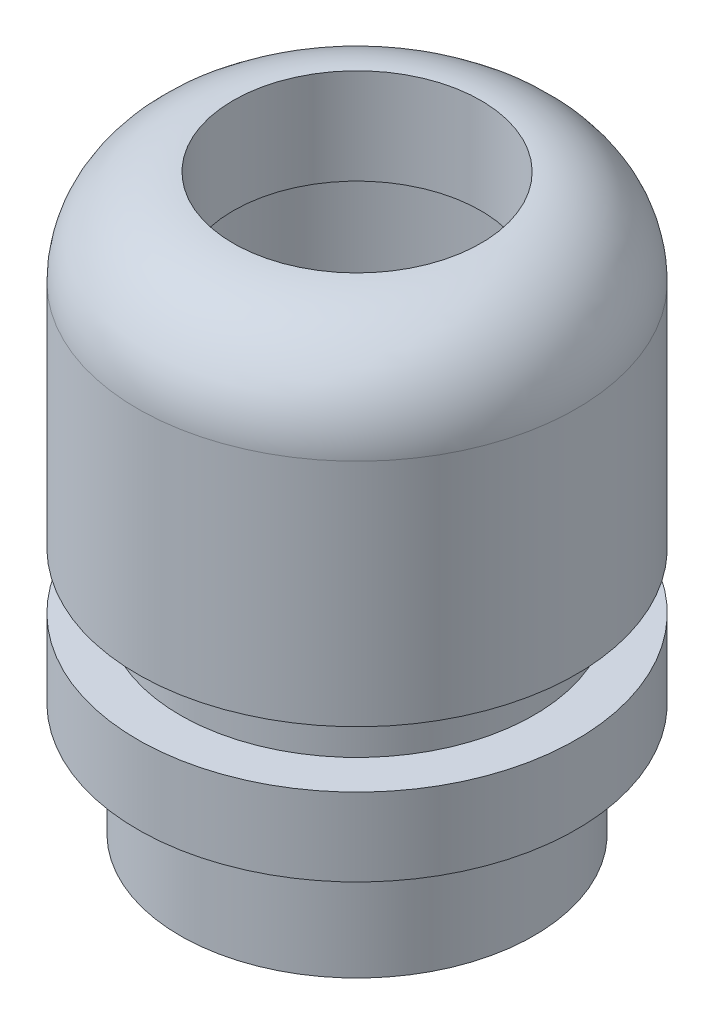
ISO-10303-21;
HEADER;
FILE_DESCRIPTION(('STEP AP214'),'2;1');
FILE_NAME('part.step','',(''),(''),'','','');
FILE_SCHEMA(('AUTOMOTIVE_DESIGN { 1 0 10303 214 1 1 1 1 }'));
ENDSEC;
DATA;
#1=APPLICATION_CONTEXT('core data for automotive mechanical design processes');
#2=APPLICATION_PROTOCOL_DEFINITION('international standard','automotive_design',2000,#1);
#3=PRODUCT_CONTEXT('',#1,'mechanical');
#4=PRODUCT('Part','Part','',(#3));
#5=PRODUCT_RELATED_PRODUCT_CATEGORY('part','',(#4));
#6=PRODUCT_DEFINITION_FORMATION('','',#4);
#7=PRODUCT_DEFINITION_CONTEXT('part definition',#1,'design');
#8=PRODUCT_DEFINITION('design','',#6,#7);
#9=PRODUCT_DEFINITION_SHAPE('','',#8);
#10=(LENGTH_UNIT() NAMED_UNIT(*) SI_UNIT(.MILLI.,.METRE.));
#11=(NAMED_UNIT(*) PLANE_ANGLE_UNIT() SI_UNIT($,.RADIAN.));
#12=(NAMED_UNIT(*) SI_UNIT($,.STERADIAN.) SOLID_ANGLE_UNIT());
#13=UNCERTAINTY_MEASURE_WITH_UNIT(LENGTH_MEASURE(1.E-05),#10,'distance_accuracy_value','');
#14=(GEOMETRIC_REPRESENTATION_CONTEXT(3) GLOBAL_UNCERTAINTY_ASSIGNED_CONTEXT((#13)) GLOBAL_UNIT_ASSIGNED_CONTEXT((#10,
#11,#12)) REPRESENTATION_CONTEXT('',''));
#15=CARTESIAN_POINT('',(0.,0.,0.));
#16=DIRECTION('',(0.,0.,1.));
#17=DIRECTION('',(1.,0.,0.));
#18=AXIS2_PLACEMENT_3D('',#15,#16,#17);
#19=CARTESIAN_POINT('',(0.,275.17510399836,0.));
#20=DIRECTION('',(0.,1.,0.));
#21=DIRECTION('',(-1.,0.,0.));
#22=AXIS2_PLACEMENT_3D('',#19,#20,#21);
#23=CYLINDRICAL_SURFACE('',#22,8.74999999999999);
#24=CARTESIAN_POINT('',(0.,20.25,0.));
#25=DIRECTION('',(0.,1.,0.));
#26=DIRECTION('',(-1.,0.,0.));
#27=AXIS2_PLACEMENT_3D('',#24,#25,#26);
#28=CIRCLE('',#27,8.74999999999999);
#29=CARTESIAN_POINT('',(-8.74999999999995,20.25,0.));
#30=VERTEX_POINT('',#29);
#31=EDGE_CURVE('E10',#30,#30,#28,.T.);
#32=ORIENTED_EDGE('',*,*,#31,.F.);
#33=EDGE_LOOP('',(#32));
#34=FACE_BOUND('',#33,.T.);
#35=CARTESIAN_POINT('',(0.,27.,0.));
#36=DIRECTION('',(0.,1.,0.));
#37=DIRECTION('',(-1.,0.,0.));
#38=AXIS2_PLACEMENT_3D('',#35,#36,#37);
#39=CIRCLE('',#38,8.74999999999999);
#40=CARTESIAN_POINT('',(-8.74999999999995,27.,0.));
#41=VERTEX_POINT('',#40);
#42=EDGE_CURVE('E76',#41,#41,#39,.T.);
#43=ORIENTED_EDGE('',*,*,#42,.T.);
#44=EDGE_LOOP('',(#43));
#45=FACE_BOUND('',#44,.T.);
#46=ADVANCED_FACE('F36',(#34,#45),#23,.F.);
#47=CARTESIAN_POINT('',(8.75000000000003,20.25,0.));
#48=DIRECTION('',(0.,1.,0.));
#49=DIRECTION('',(-1.,0.,0.));
#50=AXIS2_PLACEMENT_3D('',#47,#48,#49);
#51=PLANE('',#50);
#52=CARTESIAN_POINT('',(0.,20.25,0.));
#53=DIRECTION('',(0.,1.,0.));
#54=DIRECTION('',(-1.,0.,0.));
#55=AXIS2_PLACEMENT_3D('',#52,#53,#54);
#56=CIRCLE('',#55,11.5);
#57=CARTESIAN_POINT('',(-11.5,20.25,0.));
#58=VERTEX_POINT('',#57);
#59=EDGE_CURVE('E42',#58,#58,#56,.T.);
#60=ORIENTED_EDGE('',*,*,#59,.F.);
#61=EDGE_LOOP('',(#60));
#62=FACE_BOUND('',#61,.T.);
#63=ORIENTED_EDGE('',*,*,#31,.T.);
#64=EDGE_LOOP('',(#63));
#65=FACE_BOUND('',#64,.T.);
#66=ADVANCED_FACE('F137',(#62,#65),#51,.F.);
#67=CARTESIAN_POINT('',(0.,275.17510399836,0.));
#68=DIRECTION('',(0.,1.,0.));
#69=DIRECTION('',(-1.,0.,0.));
#70=AXIS2_PLACEMENT_3D('',#67,#68,#69);
#71=CYLINDRICAL_SURFACE('',#70,11.5);
#72=CARTESIAN_POINT('',(0.,-13.5,0.));
#73=DIRECTION('',(0.,1.,0.));
#74=DIRECTION('',(-1.,0.,0.));
#75=AXIS2_PLACEMENT_3D('',#72,#73,#74);
#76=CIRCLE('',#75,11.5);
#77=CARTESIAN_POINT('',(-11.4999999999999,-13.5,0.));
#78=VERTEX_POINT('',#77);
#79=EDGE_CURVE('E46',#78,#78,#76,.T.);
#80=ORIENTED_EDGE('',*,*,#79,.F.);
#81=EDGE_LOOP('',(#80));
#82=FACE_BOUND('',#81,.T.);
#83=ORIENTED_EDGE('',*,*,#59,.T.);
#84=EDGE_LOOP('',(#83));
#85=FACE_BOUND('',#84,.T.);
#86=ADVANCED_FACE('F132',(#82,#85),#71,.F.);
#87=CARTESIAN_POINT('',(11.5,-13.5,0.));
#88=DIRECTION('',(0.,1.,0.));
#89=DIRECTION('',(-1.,0.,0.));
#90=AXIS2_PLACEMENT_3D('',#87,#88,#89);
#91=PLANE('',#90);
#92=CARTESIAN_POINT('',(0.,-13.5,0.));
#93=DIRECTION('',(0.,1.,0.));
#94=DIRECTION('',(-1.,0.,0.));
#95=AXIS2_PLACEMENT_3D('',#92,#93,#94);
#96=CIRCLE('',#95,12.5);
#97=CARTESIAN_POINT('',(-12.4999999999999,-13.5,0.));
#98=VERTEX_POINT('',#97);
#99=EDGE_CURVE('E50',#98,#98,#96,.T.);
#100=ORIENTED_EDGE('',*,*,#99,.F.);
#101=EDGE_LOOP('',(#100));
#102=FACE_BOUND('',#101,.T.);
#103=ORIENTED_EDGE('',*,*,#79,.T.);
#104=EDGE_LOOP('',(#103));
#105=FACE_BOUND('',#104,.T.);
#106=ADVANCED_FACE('F126',(#102,#105),#91,.F.);
#107=CARTESIAN_POINT('',(0.,275.17510399836,0.));
#108=DIRECTION('',(0.,1.,0.));
#109=DIRECTION('',(-1.,0.,0.));
#110=AXIS2_PLACEMENT_3D('',#107,#108,#109);
#111=CYLINDRICAL_SURFACE('',#110,12.5);
#112=CARTESIAN_POINT('',(0.,-5.50000000000001,0.));
#113=DIRECTION('',(0.,1.,0.));
#114=DIRECTION('',(-1.,0.,0.));
#115=AXIS2_PLACEMENT_3D('',#112,#113,#114);
#116=CIRCLE('',#115,12.5);
#117=CARTESIAN_POINT('',(-12.4999999999999,-5.50000000000001,0.));
#118=VERTEX_POINT('',#117);
#119=EDGE_CURVE('E55',#118,#118,#116,.T.);
#120=ORIENTED_EDGE('',*,*,#119,.F.);
#121=EDGE_LOOP('',(#120));
#122=FACE_BOUND('',#121,.T.);
#123=ORIENTED_EDGE('',*,*,#99,.T.);
#124=EDGE_LOOP('',(#123));
#125=FACE_BOUND('',#124,.T.);
#126=ADVANCED_FACE('F120',(#122,#125),#111,.T.);
#127=CARTESIAN_POINT('',(12.5,-5.5,0.));
#128=DIRECTION('',(0.,1.,0.));
#129=DIRECTION('',(-1.,0.,0.));
#130=AXIS2_PLACEMENT_3D('',#127,#128,#129);
#131=PLANE('',#130);
#132=CARTESIAN_POINT('',(0.,-5.50000000000001,0.));
#133=DIRECTION('',(0.,1.,0.));
#134=DIRECTION('',(-1.,0.,0.));
#135=AXIS2_PLACEMENT_3D('',#132,#133,#134);
#136=CIRCLE('',#135,15.5);
#137=CARTESIAN_POINT('',(-15.4999999999999,-5.50000000000001,0.));
#138=VERTEX_POINT('',#137);
#139=EDGE_CURVE('E58',#138,#138,#136,.T.);
#140=ORIENTED_EDGE('',*,*,#139,.F.);
#141=EDGE_LOOP('',(#140));
#142=FACE_BOUND('',#141,.T.);
#143=ORIENTED_EDGE('',*,*,#119,.T.);
#144=EDGE_LOOP('',(#143));
#145=FACE_BOUND('',#144,.T.);
#146=ADVANCED_FACE('F114',(#142,#145),#131,.F.);
#147=CARTESIAN_POINT('',(0.,275.17510399836,0.));
#148=DIRECTION('',(0.,1.,0.));
#149=DIRECTION('',(-1.,0.,0.));
#150=AXIS2_PLACEMENT_3D('',#147,#148,#149);
#151=CYLINDRICAL_SURFACE('',#150,15.5);
#152=CARTESIAN_POINT('',(0.,0.,0.));
#153=DIRECTION('',(0.,1.,0.));
#154=DIRECTION('',(-1.,0.,0.));
#155=AXIS2_PLACEMENT_3D('',#152,#153,#154);
#156=CIRCLE('',#155,15.5);
#157=CARTESIAN_POINT('',(-15.4999999999999,0.,0.));
#158=VERTEX_POINT('',#157);
#159=EDGE_CURVE('E61',#158,#158,#156,.T.);
#160=ORIENTED_EDGE('',*,*,#159,.F.);
#161=EDGE_LOOP('',(#160));
#162=FACE_BOUND('',#161,.T.);
#163=ORIENTED_EDGE('',*,*,#139,.T.);
#164=EDGE_LOOP('',(#163));
#165=FACE_BOUND('',#164,.T.);
#166=ADVANCED_FACE('F108',(#162,#165),#151,.T.);
#167=CARTESIAN_POINT('',(15.5,0.,0.));
#168=DIRECTION('',(0.,-1.,0.));
#169=DIRECTION('',(1.,0.,0.));
#170=AXIS2_PLACEMENT_3D('',#167,#168,#169);
#171=PLANE('',#170);
#172=CARTESIAN_POINT('',(0.,0.,0.));
#173=DIRECTION('',(0.,1.,0.));
#174=DIRECTION('',(-1.,0.,0.));
#175=AXIS2_PLACEMENT_3D('',#172,#173,#174);
#176=CIRCLE('',#175,12.5);
#177=CARTESIAN_POINT('',(-12.5,0.,0.));
#178=VERTEX_POINT('',#177);
#179=EDGE_CURVE('E64',#178,#178,#176,.T.);
#180=ORIENTED_EDGE('',*,*,#179,.F.);
#181=EDGE_LOOP('',(#180));
#182=FACE_BOUND('',#181,.T.);
#183=ORIENTED_EDGE('',*,*,#159,.T.);
#184=EDGE_LOOP('',(#183));
#185=FACE_BOUND('',#184,.T.);
#186=ADVANCED_FACE('F102',(#182,#185),#171,.F.);
#187=CARTESIAN_POINT('',(0.,275.17510399836,0.));
#188=DIRECTION('',(0.,1.,0.));
#189=DIRECTION('',(-1.,0.,0.));
#190=AXIS2_PLACEMENT_3D('',#187,#188,#189);
#191=CYLINDRICAL_SURFACE('',#190,12.5);
#192=CARTESIAN_POINT('',(0.,4.,0.));
#193=DIRECTION('',(0.,1.,0.));
#194=DIRECTION('',(-1.,0.,0.));
#195=AXIS2_PLACEMENT_3D('',#192,#193,#194);
#196=CIRCLE('',#195,12.5);
#197=CARTESIAN_POINT('',(-12.4999999999999,4.,0.));
#198=VERTEX_POINT('',#197);
#199=EDGE_CURVE('E67',#198,#198,#196,.T.);
#200=ORIENTED_EDGE('',*,*,#199,.F.);
#201=EDGE_LOOP('',(#200));
#202=FACE_BOUND('',#201,.T.);
#203=ORIENTED_EDGE('',*,*,#179,.T.);
#204=EDGE_LOOP('',(#203));
#205=FACE_BOUND('',#204,.T.);
#206=ADVANCED_FACE('F96',(#202,#205),#191,.T.);
#207=CARTESIAN_POINT('',(12.5,4.,0.));
#208=DIRECTION('',(0.,1.,0.));
#209=DIRECTION('',(-1.,0.,0.));
#210=AXIS2_PLACEMENT_3D('',#207,#208,#209);
#211=PLANE('',#210);
#212=CARTESIAN_POINT('',(0.,4.,0.));
#213=DIRECTION('',(0.,1.,0.));
#214=DIRECTION('',(-1.,0.,0.));
#215=AXIS2_PLACEMENT_3D('',#212,#213,#214);
#216=CIRCLE('',#215,15.5);
#217=CARTESIAN_POINT('',(-15.5,4.,0.));
#218=VERTEX_POINT('',#217);
#219=EDGE_CURVE('E70',#218,#218,#216,.T.);
#220=ORIENTED_EDGE('',*,*,#219,.F.);
#221=EDGE_LOOP('',(#220));
#222=FACE_BOUND('',#221,.T.);
#223=ORIENTED_EDGE('',*,*,#199,.T.);
#224=EDGE_LOOP('',(#223));
#225=FACE_BOUND('',#224,.T.);
#226=ADVANCED_FACE('F90',(#222,#225),#211,.F.);
#227=CARTESIAN_POINT('',(0.,275.17510399836,0.));
#228=DIRECTION('',(0.,1.,0.));
#229=DIRECTION('',(-1.,0.,0.));
#230=AXIS2_PLACEMENT_3D('',#227,#228,#229);
#231=CYLINDRICAL_SURFACE('',#230,15.5);
#232=CARTESIAN_POINT('',(0.,20.25,0.));
#233=DIRECTION('',(0.,1.,0.));
#234=DIRECTION('',(-1.,0.,0.));
#235=AXIS2_PLACEMENT_3D('',#232,#233,#234);
#236=CIRCLE('',#235,15.5);
#237=CARTESIAN_POINT('',(-15.5,20.25,0.));
#238=VERTEX_POINT('',#237);
#239=EDGE_CURVE('E73',#238,#238,#236,.T.);
#240=ORIENTED_EDGE('',*,*,#239,.F.);
#241=EDGE_LOOP('',(#240));
#242=FACE_BOUND('',#241,.T.);
#243=ORIENTED_EDGE('',*,*,#219,.T.);
#244=EDGE_LOOP('',(#243));
#245=FACE_BOUND('',#244,.T.);
#246=ADVANCED_FACE('F84',(#242,#245),#231,.T.);
#247=CARTESIAN_POINT('',(0.,20.25,0.));
#248=DIRECTION('',(0.,1.,0.));
#249=DIRECTION('',(-1.,0.,0.));
#250=AXIS2_PLACEMENT_3D('',#247,#248,#249);
#251=TOROIDAL_SURFACE('',#250,8.74999999999999,6.75);
#252=ORIENTED_EDGE('',*,*,#42,.F.);
#253=EDGE_LOOP('',(#252));
#254=FACE_BOUND('',#253,.T.);
#255=ORIENTED_EDGE('',*,*,#239,.T.);
#256=EDGE_LOOP('',(#255));
#257=FACE_BOUND('',#256,.T.);
#258=ADVANCED_FACE('F81',(#254,#257),#251,.T.);
#259=CLOSED_SHELL('',(#46,#66,#86,#106,#126,#146,#166,#186,#206,#226,#246,#258));
#260=MANIFOLD_SOLID_BREP('B2',#259);
#261=ADVANCED_BREP_SHAPE_REPRESENTATION('',(#18,#260),#14);
#262=SHAPE_DEFINITION_REPRESENTATION(#9,#261);
ENDSEC;
END-ISO-10303-21;
